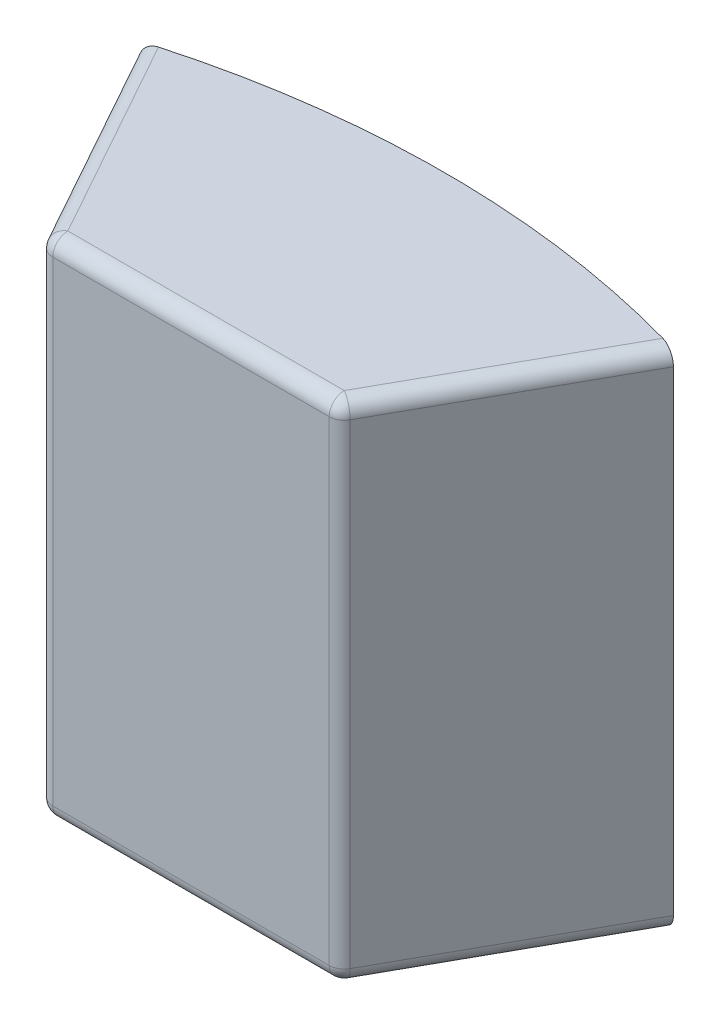
ISO-10303-21;
HEADER;
FILE_DESCRIPTION(('STEP AP214'),'2;1');
FILE_NAME('part.step','',(''),(''),'','','');
FILE_SCHEMA(('AUTOMOTIVE_DESIGN { 1 0 10303 214 1 1 1 1 }'));
ENDSEC;
DATA;
#1=APPLICATION_CONTEXT('core data for automotive mechanical design processes');
#2=APPLICATION_PROTOCOL_DEFINITION('international standard','automotive_design',2000,#1);
#3=PRODUCT_CONTEXT('',#1,'mechanical');
#4=PRODUCT('Part','Part','',(#3));
#5=PRODUCT_RELATED_PRODUCT_CATEGORY('part','',(#4));
#6=PRODUCT_DEFINITION_FORMATION('','',#4);
#7=PRODUCT_DEFINITION_CONTEXT('part definition',#1,'design');
#8=PRODUCT_DEFINITION('design','',#6,#7);
#9=PRODUCT_DEFINITION_SHAPE('','',#8);
#10=(LENGTH_UNIT() NAMED_UNIT(*) SI_UNIT(.MILLI.,.METRE.));
#11=(NAMED_UNIT(*) PLANE_ANGLE_UNIT() SI_UNIT($,.RADIAN.));
#12=(NAMED_UNIT(*) SI_UNIT($,.STERADIAN.) SOLID_ANGLE_UNIT());
#13=UNCERTAINTY_MEASURE_WITH_UNIT(LENGTH_MEASURE(1.E-05),#10,'distance_accuracy_value','');
#14=(GEOMETRIC_REPRESENTATION_CONTEXT(3) GLOBAL_UNCERTAINTY_ASSIGNED_CONTEXT((#13)) GLOBAL_UNIT_ASSIGNED_CONTEXT((#10,
#11,#12)) REPRESENTATION_CONTEXT('',''));
#15=CARTESIAN_POINT('',(0.,0.,0.));
#16=DIRECTION('',(0.,0.,1.));
#17=DIRECTION('',(1.,0.,0.));
#18=AXIS2_PLACEMENT_3D('',#15,#16,#17);
#19=CARTESIAN_POINT('',(0.,15.7443688460115,-46.555410382307));
#20=DIRECTION('',(-1.,0.,0.));
#21=DIRECTION('',(0.,0.,1.));
#22=AXIS2_PLACEMENT_3D('',#19,#20,#21);
#23=CYLINDRICAL_SURFACE('',#22,1.);
#24=CARTESIAN_POINT('',(-9.15678193456423,15.7443688460115,-46.555410382307));
#25=DIRECTION('',(-1.,0.,0.));
#26=DIRECTION('',(0.,-1.,0.));
#27=AXIS2_PLACEMENT_3D('',#24,#25,#26);
#28=CIRCLE('',#27,1.);
#29=CARTESIAN_POINT('',(-9.15678193456423,16.7443688460115,-46.555410382307));
#30=VERTEX_POINT('',#29);
#31=CARTESIAN_POINT('',(-9.15678193456423,15.7443688460115,-45.555410382307));
#32=VERTEX_POINT('',#31);
#33=EDGE_CURVE('E197',#30,#32,#28,.F.);
#34=ORIENTED_EDGE('',*,*,#33,.T.);
#35=DIRECTION('',(1.,0.,0.));
#36=VECTOR('',#35,1.);
#37=CARTESIAN_POINT('',(-9.74436884601149,15.7443688460115,-45.555410382307));
#38=LINE('',#37,#36);
#39=CARTESIAN_POINT('',(9.15678193456423,15.7443688460115,-45.555410382307));
#40=VERTEX_POINT('',#39);
#41=EDGE_CURVE('E184',#40,#32,#38,.F.);
#42=ORIENTED_EDGE('',*,*,#41,.F.);
#43=CARTESIAN_POINT('',(9.15678193456423,15.7443688460115,-46.555410382307));
#44=DIRECTION('',(-1.,0.,0.));
#45=DIRECTION('',(0.,-1.,0.));
#46=AXIS2_PLACEMENT_3D('',#43,#44,#45);
#47=CIRCLE('',#46,1.);
#48=CARTESIAN_POINT('',(9.15678193456423,16.7443688460115,-46.555410382307));
#49=VERTEX_POINT('',#48);
#50=EDGE_CURVE('E249',#49,#40,#47,.F.);
#51=ORIENTED_EDGE('',*,*,#50,.F.);
#52=DIRECTION('',(1.,0.,0.));
#53=VECTOR('',#52,1.);
#54=CARTESIAN_POINT('',(0.,16.7443688460115,-46.555410382307));
#55=LINE('',#54,#53);
#56=EDGE_CURVE('E337',#30,#49,#55,.T.);
#57=ORIENTED_EDGE('',*,*,#56,.F.);
#58=EDGE_LOOP('',(#34,#42,#51,#57));
#59=FACE_BOUND('',#58,.T.);
#60=ADVANCED_FACE('F71',(#59),#23,.T.);
#61=CARTESIAN_POINT('',(-9.15678193456423,15.7443688460115,-46.555410382307));
#62=DIRECTION('',(0.,1.,0.));
#63=DIRECTION('',(0.,0.,1.));
#64=AXIS2_PLACEMENT_3D('',#61,#62,#63);
#65=SPHERICAL_SURFACE('',#64,1.);
#66=CARTESIAN_POINT('',(-9.15678193456423,15.7443688460115,-46.555410382307));
#67=DIRECTION('',(0.486703247463818,0.,0.873567369415876));
#68=DIRECTION('',(0.873567369415876,0.,-0.486703247463818));
#69=AXIS2_PLACEMENT_3D('',#66,#67,#68);
#70=CIRCLE('',#69,1.);
#71=CARTESIAN_POINT('',(-10.0303493039801,15.7443688460115,-46.0687071348432));
#72=VERTEX_POINT('',#71);
#73=EDGE_CURVE('E181',#30,#72,#70,.T.);
#74=ORIENTED_EDGE('',*,*,#73,.T.);
#75=CARTESIAN_POINT('',(-9.15678193456423,15.7443688460115,-46.555410382307));
#76=DIRECTION('',(0.,1.,0.));
#77=DIRECTION('',(0.,0.,1.));
#78=AXIS2_PLACEMENT_3D('',#75,#76,#77);
#79=CIRCLE('',#78,1.);
#80=EDGE_CURVE('E188',#72,#32,#79,.T.);
#81=ORIENTED_EDGE('',*,*,#80,.T.);
#82=ORIENTED_EDGE('',*,*,#33,.F.);
#83=EDGE_LOOP('',(#74,#81,#82));
#84=FACE_BOUND('',#83,.T.);
#85=ADVANCED_FACE('F196',(#84),#65,.T.);
#86=CARTESIAN_POINT('',(-12.8061512776949,-15.7443688460115,-7.13487663640033));
#87=DIRECTION('',(0.486703247463818,0.,-0.873567369415876));
#88=DIRECTION('',(0.873567369415876,0.,0.486703247463818));
#89=AXIS2_PLACEMENT_3D('',#86,#87,#88);
#90=CYLINDRICAL_SURFACE('',#89,1.);
#91=CARTESIAN_POINT('',(17.695493061511,-15.7443688460115,-59.8266171207604));
#92=CARTESIAN_POINT('',(17.6954931716782,-15.7719977857389,-59.8266169756752));
#93=CARTESIAN_POINT('',(17.6943670138332,-15.7996133242751,-59.826950194677));
#94=CARTESIAN_POINT('',(17.6898762843563,-15.8546431804561,-59.8282782302956));
#95=CARTESIAN_POINT('',(17.6865119218745,-15.8820575166604,-59.8292729850949));
#96=CARTESIAN_POINT('',(17.6731028996004,-15.9636201495095,-59.8332358912684));
#97=CARTESIAN_POINT('',(17.6597421537219,-16.0172162180819,-59.8371827373618));
#98=CARTESIAN_POINT('',(17.6245927872677,-16.121297506856,-59.8475450727727));
#99=CARTESIAN_POINT('',(17.6028019890903,-16.1717819193635,-59.8539611999381));
#100=CARTESIAN_POINT('',(17.551466189381,-16.2682773051518,-59.8690348873696));
#101=CARTESIAN_POINT('',(17.521921149378,-16.3142882562369,-59.8776924587562));
#102=CARTESIAN_POINT('',(17.4556307483739,-16.401051886861,-59.8970512333114));
#103=CARTESIAN_POINT('',(17.4188162421061,-16.4417472923087,-59.9077720343677));
#104=CARTESIAN_POINT('',(17.3392521430662,-16.5163062257998,-59.9308488077757));
#105=CARTESIAN_POINT('',(17.2965012507504,-16.550168253945,-59.9432051381361));
#106=CARTESIAN_POINT('',(17.2052201087899,-16.6109387749296,-59.9694697027583));
#107=CARTESIAN_POINT('',(17.1565785030512,-16.6376670784915,-59.9834073640504));
#108=CARTESIAN_POINT('',(17.0557102259822,-16.6824768981324,-60.0121661507505));
#109=CARTESIAN_POINT('',(17.0034842274535,-16.7005600318875,-60.0269871102923));
#110=CARTESIAN_POINT('',(16.9106794190713,-16.7241779131315,-60.0531864092757));
#111=CARTESIAN_POINT('',(16.8705766362942,-16.7317474295551,-60.0644651298294));
#112=CARTESIAN_POINT('',(16.7898238907775,-16.7418428275966,-60.0870883328999));
#113=CARTESIAN_POINT('',(16.7491748203171,-16.7443761165627,-60.0984326941861));
#114=CARTESIAN_POINT('',(16.7085008415579,-16.7443688460115,-60.109737900208));
#115=B_SPLINE_CURVE_WITH_KNOTS('',3,(#91,#92,#93,#94,#95,#96,#97,#98,#99,#100,#101,#102,#103,
#104,#105,#106,#107,#108,#109,#110,#111,#112,#113,#114),.UNSPECIFIED.,.F.,.F.,(4,2,2,2,2,2,2,2,
2,2,2,4),(0.,0.0828353396263039,0.165662939753689,0.330938643942777,0.496257069721234,
0.661576315707455,0.828551169553717,0.995562633926782,1.16646132566734,1.33732802647516,
1.46405946553179,1.59060436804363),.UNSPECIFIED.);
#116=CARTESIAN_POINT('',(17.695493061511,-15.7443688460115,-59.8266171207604));
#117=VERTEX_POINT('',#116);
#118=CARTESIAN_POINT('',(16.7085008415579,-16.7443688460115,-60.109737900208));
#119=VERTEX_POINT('',#118);
#120=EDGE_CURVE('E271',#117,#119,#115,.T.);
#121=ORIENTED_EDGE('',*,*,#120,.F.);
#122=DIRECTION('',(-0.486703247463818,0.,0.873567369415876));
#123=VECTOR('',#122,1.);
#124=CARTESIAN_POINT('',(17.695493061511,-15.7443688460115,-59.8266171207604));
#125=LINE('',#124,#123);
#126=CARTESIAN_POINT('',(10.0303493039801,-15.7443688460115,-46.0687071348432));
#127=VERTEX_POINT('',#126);
#128=EDGE_CURVE('E279',#127,#117,#125,.F.);
#129=ORIENTED_EDGE('',*,*,#128,.F.);
#130=CARTESIAN_POINT('',(9.15678193456423,-15.7443688460115,-46.555410382307));
#131=DIRECTION('',(-0.486703247463818,0.,0.873567369415876));
#132=DIRECTION('',(-0.873567369415876,0.,-0.486703247463818));
#133=AXIS2_PLACEMENT_3D('',#130,#131,#132);
#134=CIRCLE('',#133,1.);
#135=CARTESIAN_POINT('',(9.15678193456423,-16.7443688460115,-46.555410382307));
#136=VERTEX_POINT('',#135);
#137=EDGE_CURVE('E360',#136,#127,#134,.T.);
#138=ORIENTED_EDGE('',*,*,#137,.F.);
#139=DIRECTION('',(-0.486703247463818,0.,0.873567369415876));
#140=VECTOR('',#139,1.);
#141=CARTESIAN_POINT('',(8.87080147659562,-16.7443688460115,-46.0421136297708));
#142=LINE('',#141,#140);
#143=EDGE_CURVE('E338',#119,#136,#142,.T.);
#144=ORIENTED_EDGE('',*,*,#143,.F.);
#145=EDGE_LOOP('',(#121,#129,#138,#144));
#146=FACE_BOUND('',#145,.T.);
#147=ADVANCED_FACE('F281',(#146),#90,.T.);
#148=CARTESIAN_POINT('',(0.,41.1675419200823,0.));
#149=DIRECTION('',(0.,-1.,0.));
#150=DIRECTION('',(0.,0.,-1.));
#151=AXIS2_PLACEMENT_3D('',#148,#149,#150);
#152=CYLINDRICAL_SURFACE('',#151,62.388737692023);
#153=DIRECTION('',(0.,-1.,0.));
#154=VECTOR('',#153,1.);
#155=CARTESIAN_POINT('',(-17.695493061511,41.1675419200823,-59.8266171207604));
#156=LINE('',#155,#154);
#157=CARTESIAN_POINT('',(-17.695493061511,15.7443688460115,-59.8266171207604));
#158=VERTEX_POINT('',#157);
#159=CARTESIAN_POINT('',(-17.695493061511,-15.7443688460115,-59.8266171207604));
#160=VERTEX_POINT('',#159);
#161=EDGE_CURVE('E194',#158,#160,#156,.T.);
#162=ORIENTED_EDGE('',*,*,#161,.F.);
#163=CARTESIAN_POINT('',(-17.695493061511,15.7443688460115,-59.8266171207604));
#164=CARTESIAN_POINT('',(-17.6954931716782,15.7719977857389,-59.8266169756752));
#165=CARTESIAN_POINT('',(-17.6943670138332,15.7996133242751,-59.826950194677));
#166=CARTESIAN_POINT('',(-17.6898762843563,15.8546431804561,-59.8282782302956));
#167=CARTESIAN_POINT('',(-17.6865119218745,15.8820575166604,-59.8292729850949));
#168=CARTESIAN_POINT('',(-17.6731028996004,15.9636201495095,-59.8332358912684));
#169=CARTESIAN_POINT('',(-17.6597421537219,16.0172162180819,-59.8371827373618));
#170=CARTESIAN_POINT('',(-17.6245927872677,16.121297506856,-59.8475450727727));
#171=CARTESIAN_POINT('',(-17.6028019890903,16.1717819193635,-59.8539611999381));
#172=CARTESIAN_POINT('',(-17.551466189381,16.2682773051518,-59.8690348873696));
#173=CARTESIAN_POINT('',(-17.521921149378,16.3142882562369,-59.8776924587562));
#174=CARTESIAN_POINT('',(-17.4556307483739,16.401051886861,-59.8970512333114));
#175=CARTESIAN_POINT('',(-17.4188162421061,16.4417472923087,-59.9077720343677));
#176=CARTESIAN_POINT('',(-17.3392521430662,16.5163062257998,-59.9308488077757));
#177=CARTESIAN_POINT('',(-17.2965012507504,16.550168253945,-59.9432051381361));
#178=CARTESIAN_POINT('',(-17.2052201087899,16.6109387749296,-59.9694697027583));
#179=CARTESIAN_POINT('',(-17.1565785030512,16.6376670784915,-59.9834073640504));
#180=CARTESIAN_POINT('',(-17.0557102259822,16.6824768981324,-60.0121661507505));
#181=CARTESIAN_POINT('',(-17.0034842274535,16.7005600318875,-60.0269871102923));
#182=CARTESIAN_POINT('',(-16.9106794190713,16.7241779131315,-60.0531864092757));
#183=CARTESIAN_POINT('',(-16.8705766362942,16.7317474295551,-60.0644651298294));
#184=CARTESIAN_POINT('',(-16.7898238907775,16.7418428275966,-60.0870883328999));
#185=CARTESIAN_POINT('',(-16.7491748203171,16.7443761165627,-60.0984326941861));
#186=CARTESIAN_POINT('',(-16.7085008415579,16.7443688460115,-60.109737900208));
#187=B_SPLINE_CURVE_WITH_KNOTS('',3,(#163,#164,#165,#166,#167,#168,#169,#170,#171,#172,#173,
#174,#175,#176,#177,#178,#179,#180,#181,#182,#183,#184,#185,#186),.UNSPECIFIED.,.F.,.F.,(4,2,2,
2,2,2,2,2,2,2,2,4),(0.,0.0828353396263039,0.165662939753689,0.330938643942777,0.496257069721234,
0.661576315707455,0.828551169553717,0.995562633926782,1.16646132566734,1.33732802647516,
1.46405946553179,1.59060436804363),.UNSPECIFIED.);
#188=CARTESIAN_POINT('',(-16.7085008415579,16.7443688460115,-60.109737900208));
#189=VERTEX_POINT('',#188);
#190=EDGE_CURVE('E164',#158,#189,#187,.T.);
#191=ORIENTED_EDGE('',*,*,#190,.T.);
#192=CARTESIAN_POINT('',(0.,16.7443688460115,0.));
#193=DIRECTION('',(0.,1.,0.));
#194=DIRECTION('',(0.,0.,1.));
#195=AXIS2_PLACEMENT_3D('',#192,#193,#194);
#196=CIRCLE('',#195,62.388737692023);
#197=CARTESIAN_POINT('',(16.7085008415579,16.7443688460115,-60.109737900208));
#198=VERTEX_POINT('',#197);
#199=EDGE_CURVE('E331',#198,#189,#196,.T.);
#200=ORIENTED_EDGE('',*,*,#199,.F.);
#201=CARTESIAN_POINT('',(17.695493061511,15.7443688460115,-59.8266171207604));
#202=CARTESIAN_POINT('',(17.6954931716782,15.7719977857389,-59.8266169756752));
#203=CARTESIAN_POINT('',(17.6943670138332,15.7996133242751,-59.826950194677));
#204=CARTESIAN_POINT('',(17.6898762843563,15.8546431804561,-59.8282782302956));
#205=CARTESIAN_POINT('',(17.6865119218745,15.8820575166604,-59.8292729850949));
#206=CARTESIAN_POINT('',(17.6731028996004,15.9636201495095,-59.8332358912684));
#207=CARTESIAN_POINT('',(17.6597421537219,16.0172162180819,-59.8371827373618));
#208=CARTESIAN_POINT('',(17.6245927872677,16.121297506856,-59.8475450727727));
#209=CARTESIAN_POINT('',(17.6028019890903,16.1717819193635,-59.8539611999381));
#210=CARTESIAN_POINT('',(17.551466189381,16.2682773051518,-59.8690348873696));
#211=CARTESIAN_POINT('',(17.521921149378,16.3142882562369,-59.8776924587562));
#212=CARTESIAN_POINT('',(17.4556307483739,16.401051886861,-59.8970512333114));
#213=CARTESIAN_POINT('',(17.4188162421061,16.4417472923087,-59.9077720343677));
#214=CARTESIAN_POINT('',(17.3392521430662,16.5163062257998,-59.9308488077757));
#215=CARTESIAN_POINT('',(17.2965012507504,16.550168253945,-59.9432051381361));
#216=CARTESIAN_POINT('',(17.2052201087899,16.6109387749296,-59.9694697027583));
#217=CARTESIAN_POINT('',(17.1565785030512,16.6376670784915,-59.9834073640504));
#218=CARTESIAN_POINT('',(17.0557102259822,16.6824768981324,-60.0121661507505));
#219=CARTESIAN_POINT('',(17.0034842274535,16.7005600318875,-60.0269871102923));
#220=CARTESIAN_POINT('',(16.9106794190713,16.7241779131315,-60.0531864092757));
#221=CARTESIAN_POINT('',(16.8705766362942,16.7317474295551,-60.0644651298294));
#222=CARTESIAN_POINT('',(16.7898238907775,16.7418428275966,-60.0870883328999));
#223=CARTESIAN_POINT('',(16.7491748203171,16.7443761165627,-60.0984326941861));
#224=CARTESIAN_POINT('',(16.7085008415579,16.7443688460115,-60.109737900208));
#225=B_SPLINE_CURVE_WITH_KNOTS('',3,(#201,#202,#203,#204,#205,#206,#207,#208,#209,#210,#211,
#212,#213,#214,#215,#216,#217,#218,#219,#220,#221,#222,#223,#224),.UNSPECIFIED.,.F.,.F.,(4,2,2,
2,2,2,2,2,2,2,2,4),(0.,0.0828353396263039,0.165662939753689,0.330938643942777,0.496257069721234,
0.661576315707455,0.828551169553717,0.995562633926782,1.16646132566734,1.33732802647516,
1.46405946553179,1.59060436804363),.UNSPECIFIED.);
#226=CARTESIAN_POINT('',(17.695493061511,15.7443688460115,-59.8266171207604));
#227=VERTEX_POINT('',#226);
#228=EDGE_CURVE('E202',#227,#198,#225,.T.);
#229=ORIENTED_EDGE('',*,*,#228,.F.);
#230=DIRECTION('',(0.,-1.,0.));
#231=VECTOR('',#230,1.);
#232=CARTESIAN_POINT('',(17.695493061511,41.1675419200823,-59.8266171207604));
#233=LINE('',#232,#231);
#234=EDGE_CURVE('E373',#227,#117,#233,.T.);
#235=ORIENTED_EDGE('',*,*,#234,.T.);
#236=ORIENTED_EDGE('',*,*,#120,.T.);
#237=CARTESIAN_POINT('',(0.,-16.7443688460115,0.));
#238=DIRECTION('',(0.,1.,0.));
#239=DIRECTION('',(0.,0.,1.));
#240=AXIS2_PLACEMENT_3D('',#237,#238,#239);
#241=CIRCLE('',#240,62.388737692023);
#242=CARTESIAN_POINT('',(-16.7085008415579,-16.7443688460115,-60.109737900208));
#243=VERTEX_POINT('',#242);
#244=EDGE_CURVE('E81',#119,#243,#241,.T.);
#245=ORIENTED_EDGE('',*,*,#244,.T.);
#246=CARTESIAN_POINT('',(-17.695493061511,-15.7443688460115,-59.8266171207604));
#247=CARTESIAN_POINT('',(-17.6954931716782,-15.7719977857389,-59.8266169756752));
#248=CARTESIAN_POINT('',(-17.6943670138332,-15.7996133242751,-59.826950194677));
#249=CARTESIAN_POINT('',(-17.6898762843563,-15.8546431804561,-59.8282782302956));
#250=CARTESIAN_POINT('',(-17.6865119218745,-15.8820575166604,-59.8292729850949));
#251=CARTESIAN_POINT('',(-17.6731028996004,-15.9636201495095,-59.8332358912684));
#252=CARTESIAN_POINT('',(-17.6597421537219,-16.0172162180819,-59.8371827373618));
#253=CARTESIAN_POINT('',(-17.6245927872677,-16.121297506856,-59.8475450727727));
#254=CARTESIAN_POINT('',(-17.6028019890903,-16.1717819193635,-59.8539611999381));
#255=CARTESIAN_POINT('',(-17.551466189381,-16.2682773051518,-59.8690348873696));
#256=CARTESIAN_POINT('',(-17.521921149378,-16.3142882562369,-59.8776924587562));
#257=CARTESIAN_POINT('',(-17.4556307483739,-16.401051886861,-59.8970512333114));
#258=CARTESIAN_POINT('',(-17.4188162421061,-16.4417472923087,-59.9077720343677));
#259=CARTESIAN_POINT('',(-17.3392521430662,-16.5163062257998,-59.9308488077757));
#260=CARTESIAN_POINT('',(-17.2965012507504,-16.550168253945,-59.9432051381361));
#261=CARTESIAN_POINT('',(-17.2052201087899,-16.6109387749296,-59.9694697027583));
#262=CARTESIAN_POINT('',(-17.1565785030512,-16.6376670784915,-59.9834073640504));
#263=CARTESIAN_POINT('',(-17.0557102259822,-16.6824768981324,-60.0121661507505));
#264=CARTESIAN_POINT('',(-17.0034842274535,-16.7005600318875,-60.0269871102923));
#265=CARTESIAN_POINT('',(-16.9106794190713,-16.7241779131315,-60.0531864092757));
#266=CARTESIAN_POINT('',(-16.8705766362942,-16.7317474295551,-60.0644651298294));
#267=CARTESIAN_POINT('',(-16.7898238907775,-16.7418428275966,-60.0870883328999));
#268=CARTESIAN_POINT('',(-16.7491748203171,-16.7443761165627,-60.0984326941861));
#269=CARTESIAN_POINT('',(-16.7085008415579,-16.7443688460115,-60.109737900208));
#270=B_SPLINE_CURVE_WITH_KNOTS('',3,(#246,#247,#248,#249,#250,#251,#252,#253,#254,#255,#256,
#257,#258,#259,#260,#261,#262,#263,#264,#265,#266,#267,#268,#269),.UNSPECIFIED.,.F.,.F.,(4,2,2,
2,2,2,2,2,2,2,2,4),(0.,0.0828353396263039,0.165662939753689,0.330938643942777,0.496257069721234,
0.661576315707455,0.828551169553717,0.995562633926782,1.16646132566734,1.33732802647516,
1.46405946553179,1.59060436804363),.UNSPECIFIED.);
#271=EDGE_CURVE('E122',#160,#243,#270,.T.);
#272=ORIENTED_EDGE('',*,*,#271,.F.);
#273=EDGE_LOOP('',(#162,#191,#200,#229,#235,#236,#245,#272));
#274=FACE_BOUND('',#273,.T.);
#275=ADVANCED_FACE('F216',(#274),#152,.T.);
#276=CARTESIAN_POINT('',(-11.932583908279,41.1675419200823,-6.64817338893652));
#277=DIRECTION('',(-0.873567369415876,0.,-0.486703247463818));
#278=DIRECTION('',(0.486703247463818,0.,-0.873567369415876));
#279=AXIS2_PLACEMENT_3D('',#276,#277,#278);
#280=PLANE('',#279);
#281=DIRECTION('',(0.,-1.,0.));
#282=VECTOR('',#281,1.);
#283=CARTESIAN_POINT('',(10.0303493039801,41.1675419200823,-46.0687071348432));
#284=LINE('',#283,#282);
#285=CARTESIAN_POINT('',(10.0303493039801,15.7443688460115,-46.0687071348432));
#286=VERTEX_POINT('',#285);
#287=EDGE_CURVE('E214',#127,#286,#284,.F.);
#288=ORIENTED_EDGE('',*,*,#287,.F.);
#289=ORIENTED_EDGE('',*,*,#128,.T.);
#290=ORIENTED_EDGE('',*,*,#234,.F.);
#291=DIRECTION('',(-0.486703247463818,0.,0.873567369415876));
#292=VECTOR('',#291,1.);
#293=CARTESIAN_POINT('',(17.695493061511,15.7443688460115,-59.8266171207604));
#294=LINE('',#293,#292);
#295=EDGE_CURVE('E382',#286,#227,#294,.F.);
#296=ORIENTED_EDGE('',*,*,#295,.F.);
#297=EDGE_LOOP('',(#288,#289,#290,#296));
#298=FACE_BOUND('',#297,.T.);
#299=ADVANCED_FACE('F232',(#298),#280,.F.);
#300=CARTESIAN_POINT('',(0.,-15.7443688460115,-46.555410382307));
#301=DIRECTION('',(-1.,0.,0.));
#302=DIRECTION('',(0.,0.,1.));
#303=AXIS2_PLACEMENT_3D('',#300,#301,#302);
#304=CYLINDRICAL_SURFACE('',#303,1.);
#305=CARTESIAN_POINT('',(-9.15678193456423,-15.7443688460115,-46.555410382307));
#306=DIRECTION('',(1.,0.,0.));
#307=DIRECTION('',(0.,1.,0.));
#308=AXIS2_PLACEMENT_3D('',#305,#306,#307);
#309=CIRCLE('',#308,1.);
#310=CARTESIAN_POINT('',(-9.15678193456423,-16.7443688460115,-46.555410382307));
#311=VERTEX_POINT('',#310);
#312=CARTESIAN_POINT('',(-9.15678193456423,-15.7443688460115,-45.555410382307));
#313=VERTEX_POINT('',#312);
#314=EDGE_CURVE('E268',#311,#313,#309,.F.);
#315=ORIENTED_EDGE('',*,*,#314,.F.);
#316=DIRECTION('',(1.,0.,0.));
#317=VECTOR('',#316,1.);
#318=CARTESIAN_POINT('',(0.,-16.7443688460115,-46.555410382307));
#319=LINE('',#318,#317);
#320=EDGE_CURVE('E11',#311,#136,#319,.T.);
#321=ORIENTED_EDGE('',*,*,#320,.T.);
#322=CARTESIAN_POINT('',(9.15678193456423,-15.7443688460115,-46.555410382307));
#323=DIRECTION('',(1.,0.,0.));
#324=DIRECTION('',(0.,1.,0.));
#325=AXIS2_PLACEMENT_3D('',#322,#323,#324);
#326=CIRCLE('',#325,1.);
#327=CARTESIAN_POINT('',(9.15678193456423,-15.7443688460115,-45.555410382307));
#328=VERTEX_POINT('',#327);
#329=EDGE_CURVE('E355',#136,#328,#326,.F.);
#330=ORIENTED_EDGE('',*,*,#329,.T.);
#331=DIRECTION('',(1.,0.,0.));
#332=VECTOR('',#331,1.);
#333=CARTESIAN_POINT('',(-9.74436884601149,-15.7443688460115,-45.555410382307));
#334=LINE('',#333,#332);
#335=EDGE_CURVE('E252',#328,#313,#334,.F.);
#336=ORIENTED_EDGE('',*,*,#335,.T.);
#337=EDGE_LOOP('',(#315,#321,#330,#336));
#338=FACE_BOUND('',#337,.T.);
#339=ADVANCED_FACE('F286',(#338),#304,.T.);
#340=CARTESIAN_POINT('',(-9.15678193456423,-15.7443688460115,-46.555410382307));
#341=DIRECTION('',(0.,-1.,0.));
#342=DIRECTION('',(0.,0.,1.));
#343=AXIS2_PLACEMENT_3D('',#340,#341,#342);
#344=SPHERICAL_SURFACE('',#343,1.);
#345=CARTESIAN_POINT('',(-9.15678193456423,-15.7443688460115,-46.555410382307));
#346=DIRECTION('',(-0.486703247463818,0.,-0.873567369415876));
#347=DIRECTION('',(0.873567369415876,0.,-0.486703247463818));
#348=AXIS2_PLACEMENT_3D('',#345,#346,#347);
#349=CIRCLE('',#348,1.);
#350=CARTESIAN_POINT('',(-10.0303493039801,-15.7443688460115,-46.0687071348432));
#351=VERTEX_POINT('',#350);
#352=EDGE_CURVE('E114',#311,#351,#349,.T.);
#353=ORIENTED_EDGE('',*,*,#352,.F.);
#354=ORIENTED_EDGE('',*,*,#314,.T.);
#355=CARTESIAN_POINT('',(-9.15678193456423,-15.7443688460115,-46.555410382307));
#356=DIRECTION('',(0.,1.,0.));
#357=DIRECTION('',(0.,0.,1.));
#358=AXIS2_PLACEMENT_3D('',#355,#356,#357);
#359=CIRCLE('',#358,1.);
#360=EDGE_CURVE('E256',#351,#313,#359,.T.);
#361=ORIENTED_EDGE('',*,*,#360,.F.);
#362=EDGE_LOOP('',(#353,#354,#361));
#363=FACE_BOUND('',#362,.T.);
#364=ADVANCED_FACE('F301',(#363),#344,.T.);
#365=CARTESIAN_POINT('',(9.15678193456423,-15.7443688460115,-46.555410382307));
#366=DIRECTION('',(0.,-1.,0.));
#367=DIRECTION('',(0.,0.,1.));
#368=AXIS2_PLACEMENT_3D('',#365,#366,#367);
#369=SPHERICAL_SURFACE('',#368,1.);
#370=ORIENTED_EDGE('',*,*,#137,.T.);
#371=CARTESIAN_POINT('',(9.15678193456423,-15.7443688460115,-46.555410382307));
#372=DIRECTION('',(0.,-1.,0.));
#373=DIRECTION('',(0.,0.,1.));
#374=AXIS2_PLACEMENT_3D('',#371,#372,#373);
#375=CIRCLE('',#374,1.);
#376=EDGE_CURVE('E359',#127,#328,#375,.T.);
#377=ORIENTED_EDGE('',*,*,#376,.T.);
#378=ORIENTED_EDGE('',*,*,#329,.F.);
#379=EDGE_LOOP('',(#370,#377,#378));
#380=FACE_BOUND('',#379,.T.);
#381=ADVANCED_FACE('F306',(#380),#369,.T.);
#382=CARTESIAN_POINT('',(0.,41.1675419200823,-45.555410382307));
#383=DIRECTION('',(0.,0.,-1.));
#384=DIRECTION('',(-1.,0.,0.));
#385=AXIS2_PLACEMENT_3D('',#382,#383,#384);
#386=PLANE('',#385);
#387=DIRECTION('',(0.,-1.,0.));
#388=VECTOR('',#387,1.);
#389=CARTESIAN_POINT('',(9.15678193456423,41.1675419200823,-45.555410382307));
#390=LINE('',#389,#388);
#391=EDGE_CURVE('E131',#40,#328,#390,.T.);
#392=ORIENTED_EDGE('',*,*,#391,.F.);
#393=ORIENTED_EDGE('',*,*,#41,.T.);
#394=DIRECTION('',(0.,-1.,0.));
#395=VECTOR('',#394,1.);
#396=CARTESIAN_POINT('',(-9.15678193456423,41.1675419200823,-45.555410382307));
#397=LINE('',#396,#395);
#398=EDGE_CURVE('E190',#32,#313,#397,.T.);
#399=ORIENTED_EDGE('',*,*,#398,.T.);
#400=ORIENTED_EDGE('',*,*,#335,.F.);
#401=EDGE_LOOP('',(#392,#393,#399,#400));
#402=FACE_BOUND('',#401,.T.);
#403=ADVANCED_FACE('F315',(#402),#386,.F.);
#404=CARTESIAN_POINT('',(11.932583908279,41.1675419200823,-6.64817338893652));
#405=DIRECTION('',(0.873567369415876,0.,-0.486703247463818));
#406=DIRECTION('',(-0.486703247463818,0.,-0.873567369415876));
#407=AXIS2_PLACEMENT_3D('',#404,#405,#406);
#408=PLANE('',#407);
#409=ORIENTED_EDGE('',*,*,#161,.T.);
#410=DIRECTION('',(0.486703247463818,0.,0.873567369415876));
#411=VECTOR('',#410,1.);
#412=CARTESIAN_POINT('',(-17.695493061511,-15.7443688460115,-59.8266171207604));
#413=LINE('',#412,#411);
#414=EDGE_CURVE('E173',#351,#160,#413,.F.);
#415=ORIENTED_EDGE('',*,*,#414,.F.);
#416=DIRECTION('',(0.,-1.,0.));
#417=VECTOR('',#416,1.);
#418=CARTESIAN_POINT('',(-10.0303493039801,41.1675419200823,-46.0687071348432));
#419=LINE('',#418,#417);
#420=EDGE_CURVE('E169',#351,#72,#419,.F.);
#421=ORIENTED_EDGE('',*,*,#420,.T.);
#422=DIRECTION('',(0.486703247463818,0.,0.873567369415876));
#423=VECTOR('',#422,1.);
#424=CARTESIAN_POINT('',(-17.695493061511,15.7443688460115,-59.8266171207604));
#425=LINE('',#424,#423);
#426=EDGE_CURVE('E171',#72,#158,#425,.F.);
#427=ORIENTED_EDGE('',*,*,#426,.T.);
#428=EDGE_LOOP('',(#409,#415,#421,#427));
#429=FACE_BOUND('',#428,.T.);
#430=ADVANCED_FACE('F170',(#429),#408,.F.);
#431=CARTESIAN_POINT('',(12.8061512776949,15.7443688460115,-7.13487663640033));
#432=DIRECTION('',(-0.486703247463818,0.,-0.873567369415876));
#433=DIRECTION('',(-0.873567369415876,0.,0.486703247463818));
#434=AXIS2_PLACEMENT_3D('',#431,#432,#433);
#435=CYLINDRICAL_SURFACE('',#434,1.);
#436=ORIENTED_EDGE('',*,*,#190,.F.);
#437=ORIENTED_EDGE('',*,*,#426,.F.);
#438=ORIENTED_EDGE('',*,*,#73,.F.);
#439=DIRECTION('',(0.486703247463818,0.,0.873567369415876));
#440=VECTOR('',#439,1.);
#441=CARTESIAN_POINT('',(-8.87080147659562,16.7443688460115,-46.0421136297708));
#442=LINE('',#441,#440);
#443=EDGE_CURVE('E333',#189,#30,#442,.T.);
#444=ORIENTED_EDGE('',*,*,#443,.F.);
#445=EDGE_LOOP('',(#436,#437,#438,#444));
#446=FACE_BOUND('',#445,.T.);
#447=ADVANCED_FACE('F179',(#446),#435,.T.);
#448=CARTESIAN_POINT('',(-12.8061512776949,15.7443688460115,-7.13487663640033));
#449=DIRECTION('',(0.486703247463818,0.,-0.873567369415876));
#450=DIRECTION('',(0.873567369415876,0.,0.486703247463818));
#451=AXIS2_PLACEMENT_3D('',#448,#449,#450);
#452=CYLINDRICAL_SURFACE('',#451,1.);
#453=ORIENTED_EDGE('',*,*,#228,.T.);
#454=DIRECTION('',(-0.486703247463818,0.,0.873567369415876));
#455=VECTOR('',#454,1.);
#456=CARTESIAN_POINT('',(8.87080147659562,16.7443688460115,-46.0421136297708));
#457=LINE('',#456,#455);
#458=EDGE_CURVE('E335',#198,#49,#457,.T.);
#459=ORIENTED_EDGE('',*,*,#458,.T.);
#460=CARTESIAN_POINT('',(9.15678193456423,15.7443688460115,-46.555410382307));
#461=DIRECTION('',(0.486703247463818,0.,-0.873567369415876));
#462=DIRECTION('',(-0.873567369415876,0.,-0.486703247463818));
#463=AXIS2_PLACEMENT_3D('',#460,#461,#462);
#464=CIRCLE('',#463,1.);
#465=EDGE_CURVE('E89',#49,#286,#464,.T.);
#466=ORIENTED_EDGE('',*,*,#465,.T.);
#467=ORIENTED_EDGE('',*,*,#295,.T.);
#468=EDGE_LOOP('',(#453,#459,#466,#467));
#469=FACE_BOUND('',#468,.T.);
#470=ADVANCED_FACE('F219',(#469),#452,.T.);
#471=CARTESIAN_POINT('',(12.8061512776949,-15.7443688460115,-7.13487663640033));
#472=DIRECTION('',(-0.486703247463818,0.,-0.873567369415876));
#473=DIRECTION('',(-0.873567369415876,0.,0.486703247463818));
#474=AXIS2_PLACEMENT_3D('',#471,#472,#473);
#475=CYLINDRICAL_SURFACE('',#474,1.);
#476=ORIENTED_EDGE('',*,*,#271,.T.);
#477=DIRECTION('',(0.486703247463818,0.,0.873567369415876));
#478=VECTOR('',#477,1.);
#479=CARTESIAN_POINT('',(-8.87080147659562,-16.7443688460115,-46.0421136297708));
#480=LINE('',#479,#478);
#481=EDGE_CURVE('E344',#243,#311,#480,.T.);
#482=ORIENTED_EDGE('',*,*,#481,.T.);
#483=ORIENTED_EDGE('',*,*,#352,.T.);
#484=ORIENTED_EDGE('',*,*,#414,.T.);
#485=EDGE_LOOP('',(#476,#482,#483,#484));
#486=FACE_BOUND('',#485,.T.);
#487=ADVANCED_FACE('F223',(#486),#475,.T.);
#488=CARTESIAN_POINT('',(9.15678193456423,15.7443688460115,-46.555410382307));
#489=DIRECTION('',(0.,1.,0.));
#490=DIRECTION('',(0.,0.,1.));
#491=AXIS2_PLACEMENT_3D('',#488,#489,#490);
#492=SPHERICAL_SURFACE('',#491,1.);
#493=ORIENTED_EDGE('',*,*,#465,.F.);
#494=ORIENTED_EDGE('',*,*,#50,.T.);
#495=CARTESIAN_POINT('',(9.15678193456423,15.7443688460115,-46.555410382307));
#496=DIRECTION('',(0.,-1.,0.));
#497=DIRECTION('',(0.,0.,1.));
#498=AXIS2_PLACEMENT_3D('',#495,#496,#497);
#499=CIRCLE('',#498,1.);
#500=EDGE_CURVE('E377',#286,#40,#499,.T.);
#501=ORIENTED_EDGE('',*,*,#500,.F.);
#502=EDGE_LOOP('',(#493,#494,#501));
#503=FACE_BOUND('',#502,.T.);
#504=ADVANCED_FACE('F290',(#503),#492,.T.);
#505=CARTESIAN_POINT('',(-9.15678193456423,41.1675419200823,-46.555410382307));
#506=DIRECTION('',(0.,-1.,0.));
#507=DIRECTION('',(0.,0.,-1.));
#508=AXIS2_PLACEMENT_3D('',#505,#506,#507);
#509=CYLINDRICAL_SURFACE('',#508,1.);
#510=ORIENTED_EDGE('',*,*,#420,.F.);
#511=ORIENTED_EDGE('',*,*,#360,.T.);
#512=ORIENTED_EDGE('',*,*,#398,.F.);
#513=ORIENTED_EDGE('',*,*,#80,.F.);
#514=EDGE_LOOP('',(#510,#511,#512,#513));
#515=FACE_BOUND('',#514,.T.);
#516=ADVANCED_FACE('F189',(#515),#509,.T.);
#517=CARTESIAN_POINT('',(9.15678193456423,41.1675419200823,-46.555410382307));
#518=DIRECTION('',(0.,-1.,0.));
#519=DIRECTION('',(0.,0.,-1.));
#520=AXIS2_PLACEMENT_3D('',#517,#518,#519);
#521=CYLINDRICAL_SURFACE('',#520,1.);
#522=ORIENTED_EDGE('',*,*,#391,.T.);
#523=ORIENTED_EDGE('',*,*,#376,.F.);
#524=ORIENTED_EDGE('',*,*,#287,.T.);
#525=ORIENTED_EDGE('',*,*,#500,.T.);
#526=EDGE_LOOP('',(#522,#523,#524,#525));
#527=FACE_BOUND('',#526,.T.);
#528=ADVANCED_FACE('F308',(#527),#521,.T.);
#529=CARTESIAN_POINT('',(0.,-16.7443688460115,0.));
#530=DIRECTION('',(0.,-1.,0.));
#531=DIRECTION('',(0.,0.,1.));
#532=AXIS2_PLACEMENT_3D('',#529,#530,#531);
#533=PLANE('',#532);
#534=ORIENTED_EDGE('',*,*,#481,.F.);
#535=ORIENTED_EDGE('',*,*,#244,.F.);
#536=ORIENTED_EDGE('',*,*,#143,.T.);
#537=ORIENTED_EDGE('',*,*,#320,.F.);
#538=EDGE_LOOP('',(#534,#535,#536,#537));
#539=FACE_BOUND('',#538,.T.);
#540=ADVANCED_FACE('F300',(#539),#533,.T.);
#541=CARTESIAN_POINT('',(0.,16.7443688460115,0.));
#542=DIRECTION('',(0.,1.,0.));
#543=DIRECTION('',(0.,0.,1.));
#544=AXIS2_PLACEMENT_3D('',#541,#542,#543);
#545=PLANE('',#544);
#546=ORIENTED_EDGE('',*,*,#199,.T.);
#547=ORIENTED_EDGE('',*,*,#443,.T.);
#548=ORIENTED_EDGE('',*,*,#56,.T.);
#549=ORIENTED_EDGE('',*,*,#458,.F.);
#550=EDGE_LOOP('',(#546,#547,#548,#549));
#551=FACE_BOUND('',#550,.T.);
#552=ADVANCED_FACE('F231',(#551),#545,.T.);
#553=CLOSED_SHELL('',(#60,#85,#147,#275,#299,#339,#364,#381,#403,#430,#447,#470,#487,#504,#516,
#528,#540,#552));
#554=MANIFOLD_SOLID_BREP('B2',#553);
#555=ADVANCED_BREP_SHAPE_REPRESENTATION('',(#18,#554),#14);
#556=SHAPE_DEFINITION_REPRESENTATION(#9,#555);
ENDSEC;
END-ISO-10303-21;
